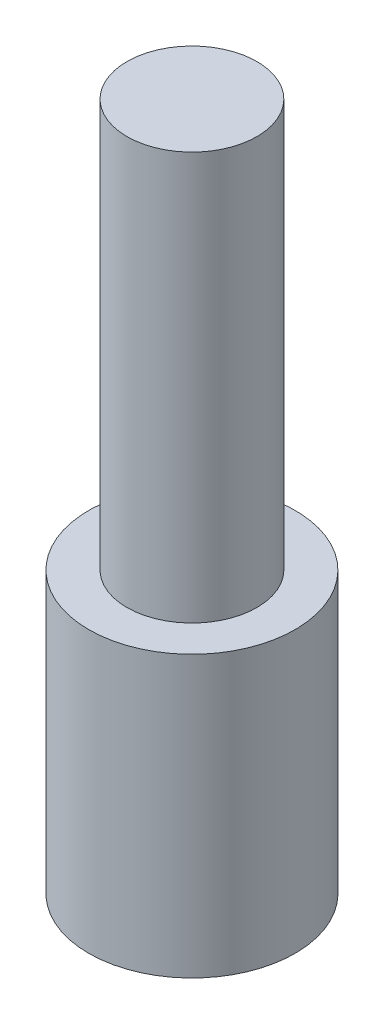
ISO-10303-21;
HEADER;
FILE_DESCRIPTION(('STEP AP214'),'2;1');
FILE_NAME('part.step','',(''),(''),'','','');
FILE_SCHEMA(('AUTOMOTIVE_DESIGN { 1 0 10303 214 1 1 1 1 }'));
ENDSEC;
DATA;
#1=APPLICATION_CONTEXT('core data for automotive mechanical design processes');
#2=APPLICATION_PROTOCOL_DEFINITION('international standard','automotive_design',2000,#1);
#3=PRODUCT_CONTEXT('',#1,'mechanical');
#4=PRODUCT('Part','Part','',(#3));
#5=PRODUCT_RELATED_PRODUCT_CATEGORY('part','',(#4));
#6=PRODUCT_DEFINITION_FORMATION('','',#4);
#7=PRODUCT_DEFINITION_CONTEXT('part definition',#1,'design');
#8=PRODUCT_DEFINITION('design','',#6,#7);
#9=PRODUCT_DEFINITION_SHAPE('','',#8);
#10=(LENGTH_UNIT() NAMED_UNIT(*) SI_UNIT(.MILLI.,.METRE.));
#11=(NAMED_UNIT(*) PLANE_ANGLE_UNIT() SI_UNIT($,.RADIAN.));
#12=(NAMED_UNIT(*) SI_UNIT($,.STERADIAN.) SOLID_ANGLE_UNIT());
#13=UNCERTAINTY_MEASURE_WITH_UNIT(LENGTH_MEASURE(1.E-05),#10,'distance_accuracy_value','');
#14=(GEOMETRIC_REPRESENTATION_CONTEXT(3) GLOBAL_UNCERTAINTY_ASSIGNED_CONTEXT((#13)) GLOBAL_UNIT_ASSIGNED_CONTEXT((#10,
#11,#12)) REPRESENTATION_CONTEXT('',''));
#15=CARTESIAN_POINT('',(0.,0.,0.));
#16=DIRECTION('',(0.,0.,1.));
#17=DIRECTION('',(1.,0.,0.));
#18=AXIS2_PLACEMENT_3D('',#15,#16,#17);
#19=CARTESIAN_POINT('',(0.,11.,0.));
#20=DIRECTION('',(0.,-1.,0.));
#21=DIRECTION('',(0.,0.,-1.));
#22=AXIS2_PLACEMENT_3D('',#19,#20,#21);
#23=CYLINDRICAL_SURFACE('',#22,4.05);
#24=CARTESIAN_POINT('',(0.,11.,0.));
#25=DIRECTION('',(0.,1.,0.));
#26=DIRECTION('',(0.,0.,1.));
#27=AXIS2_PLACEMENT_3D('',#24,#25,#26);
#28=CIRCLE('',#27,4.05);
#29=CARTESIAN_POINT('',(0.,11.,4.05));
#30=VERTEX_POINT('',#29);
#31=EDGE_CURVE('E42',#30,#30,#28,.T.);
#32=ORIENTED_EDGE('',*,*,#31,.F.);
#33=EDGE_LOOP('',(#32));
#34=FACE_BOUND('',#33,.T.);
#35=CARTESIAN_POINT('',(0.,0.,0.));
#36=DIRECTION('',(0.,1.,0.));
#37=DIRECTION('',(0.,0.,1.));
#38=AXIS2_PLACEMENT_3D('',#35,#36,#37);
#39=CIRCLE('',#38,4.05);
#40=CARTESIAN_POINT('',(0.,0.,4.05));
#41=VERTEX_POINT('',#40);
#42=EDGE_CURVE('E38',#41,#41,#39,.T.);
#43=ORIENTED_EDGE('',*,*,#42,.T.);
#44=EDGE_LOOP('',(#43));
#45=FACE_BOUND('',#44,.T.);
#46=ADVANCED_FACE('F35',(#34,#45),#23,.T.);
#47=CARTESIAN_POINT('',(0.,11.,0.));
#48=DIRECTION('',(0.,1.,0.));
#49=DIRECTION('',(0.,0.,1.));
#50=AXIS2_PLACEMENT_3D('',#47,#48,#49);
#51=PLANE('',#50);
#52=CARTESIAN_POINT('',(0.,11.,0.));
#53=DIRECTION('',(0.,1.,0.));
#54=DIRECTION('',(0.,0.,1.));
#55=AXIS2_PLACEMENT_3D('',#52,#53,#54);
#56=CIRCLE('',#55,2.55);
#57=CARTESIAN_POINT('',(0.,11.,2.55));
#58=VERTEX_POINT('',#57);
#59=EDGE_CURVE('E10',#58,#58,#56,.T.);
#60=ORIENTED_EDGE('',*,*,#59,.F.);
#61=EDGE_LOOP('',(#60));
#62=FACE_BOUND('',#61,.T.);
#63=ORIENTED_EDGE('',*,*,#31,.T.);
#64=EDGE_LOOP('',(#63));
#65=FACE_BOUND('',#64,.T.);
#66=ADVANCED_FACE('F59',(#62,#65),#51,.T.);
#67=CARTESIAN_POINT('',(0.,0.,0.));
#68=DIRECTION('',(0.,1.,0.));
#69=DIRECTION('',(0.,0.,1.));
#70=AXIS2_PLACEMENT_3D('',#67,#68,#69);
#71=PLANE('',#70);
#72=ORIENTED_EDGE('',*,*,#42,.F.);
#73=EDGE_LOOP('',(#72));
#74=FACE_BOUND('',#73,.T.);
#75=ADVANCED_FACE('F56',(#74),#71,.F.);
#76=CARTESIAN_POINT('',(0.,27.,0.));
#77=DIRECTION('',(0.,-1.,0.));
#78=DIRECTION('',(0.,0.,-1.));
#79=AXIS2_PLACEMENT_3D('',#76,#77,#78);
#80=CYLINDRICAL_SURFACE('',#79,2.55);
#81=CARTESIAN_POINT('',(0.,27.,0.));
#82=DIRECTION('',(0.,1.,0.));
#83=DIRECTION('',(0.,0.,1.));
#84=AXIS2_PLACEMENT_3D('',#81,#82,#83);
#85=CIRCLE('',#84,2.55);
#86=CARTESIAN_POINT('',(0.,27.,2.55));
#87=VERTEX_POINT('',#86);
#88=EDGE_CURVE('E48',#87,#87,#85,.T.);
#89=ORIENTED_EDGE('',*,*,#88,.F.);
#90=EDGE_LOOP('',(#89));
#91=FACE_BOUND('',#90,.T.);
#92=ORIENTED_EDGE('',*,*,#59,.T.);
#93=EDGE_LOOP('',(#92));
#94=FACE_BOUND('',#93,.T.);
#95=ADVANCED_FACE('F58',(#91,#94),#80,.T.);
#96=CARTESIAN_POINT('',(0.,27.,0.));
#97=DIRECTION('',(0.,1.,0.));
#98=DIRECTION('',(0.,0.,1.));
#99=AXIS2_PLACEMENT_3D('',#96,#97,#98);
#100=PLANE('',#99);
#101=ORIENTED_EDGE('',*,*,#88,.T.);
#102=EDGE_LOOP('',(#101));
#103=FACE_BOUND('',#102,.T.);
#104=ADVANCED_FACE('F64',(#103),#100,.T.);
#105=CLOSED_SHELL('',(#46,#66,#75,#95,#104));
#106=MANIFOLD_SOLID_BREP('B2',#105);
#107=ADVANCED_BREP_SHAPE_REPRESENTATION('',(#18,#106),#14);
#108=SHAPE_DEFINITION_REPRESENTATION(#9,#107);
ENDSEC;
END-ISO-10303-21;
